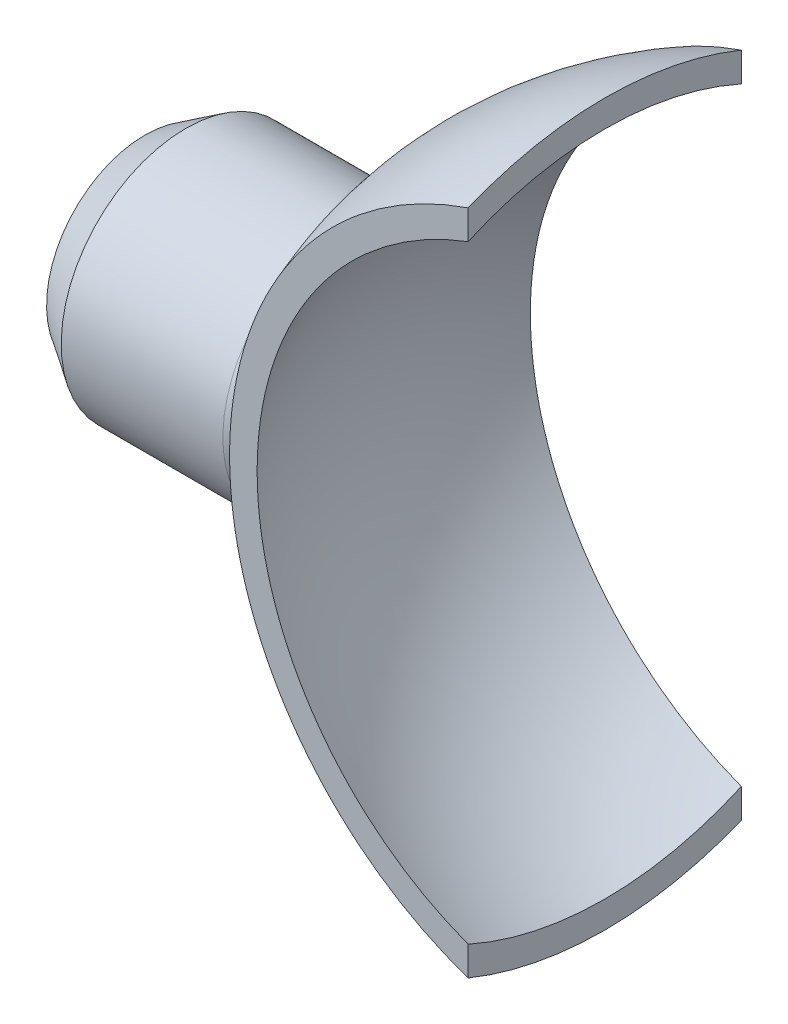
ISO-10303-21;
HEADER;
FILE_DESCRIPTION(('STEP AP214'),'2;1');
FILE_NAME('part.step','',(''),(''),'','','');
FILE_SCHEMA(('AUTOMOTIVE_DESIGN { 1 0 10303 214 1 1 1 1 }'));
ENDSEC;
DATA;
#1=APPLICATION_CONTEXT('core data for automotive mechanical design processes');
#2=APPLICATION_PROTOCOL_DEFINITION('international standard','automotive_design',2000,#1);
#3=PRODUCT_CONTEXT('',#1,'mechanical');
#4=PRODUCT('Part','Part','',(#3));
#5=PRODUCT_RELATED_PRODUCT_CATEGORY('part','',(#4));
#6=PRODUCT_DEFINITION_FORMATION('','',#4);
#7=PRODUCT_DEFINITION_CONTEXT('part definition',#1,'design');
#8=PRODUCT_DEFINITION('design','',#6,#7);
#9=PRODUCT_DEFINITION_SHAPE('','',#8);
#10=(LENGTH_UNIT() NAMED_UNIT(*) SI_UNIT(.MILLI.,.METRE.));
#11=(NAMED_UNIT(*) PLANE_ANGLE_UNIT() SI_UNIT($,.RADIAN.));
#12=(NAMED_UNIT(*) SI_UNIT($,.STERADIAN.) SOLID_ANGLE_UNIT());
#13=UNCERTAINTY_MEASURE_WITH_UNIT(LENGTH_MEASURE(1.E-05),#10,'distance_accuracy_value','');
#14=(GEOMETRIC_REPRESENTATION_CONTEXT(3) GLOBAL_UNCERTAINTY_ASSIGNED_CONTEXT((#13)) GLOBAL_UNIT_ASSIGNED_CONTEXT((#10,
#11,#12)) REPRESENTATION_CONTEXT('',''));
#15=CARTESIAN_POINT('',(0.,0.,0.));
#16=DIRECTION('',(0.,0.,1.));
#17=DIRECTION('',(1.,0.,0.));
#18=AXIS2_PLACEMENT_3D('',#15,#16,#17);
#19=CARTESIAN_POINT('',(7.09806099724113,9.9227201678389,0.));
#20=DIRECTION('',(1.,0.,0.));
#21=DIRECTION('',(0.,1.,0.));
#22=AXIS2_PLACEMENT_3D('',#19,#20,#21);
#23=PLANE('',#22);
#24=DIRECTION('',(0.,-1.,0.));
#25=VECTOR('',#24,1.);
#26=CARTESIAN_POINT('',(7.09806099724113,9.9227201678389,-4.065));
#27=LINE('',#26,#25);
#28=CARTESIAN_POINT('',(7.09806099724113,9.92284118305109,-4.065));
#29=VERTEX_POINT('',#28);
#30=CARTESIAN_POINT('',(7.09806099724113,9.05185895433843,-4.065));
#31=VERTEX_POINT('',#30);
#32=EDGE_CURVE('E72',#29,#31,#27,.T.);
#33=ORIENTED_EDGE('',*,*,#32,.F.);
#34=CARTESIAN_POINT('',(7.09806099724114,0.,0.));
#35=DIRECTION('',(1.,0.,0.));
#36=DIRECTION('',(0.,1.,0.));
#37=AXIS2_PLACEMENT_3D('',#34,#35,#36);
#38=CIRCLE('',#37,10.7231992494803);
#39=CARTESIAN_POINT('',(7.09806099724114,9.92284118305109,4.065));
#40=VERTEX_POINT('',#39);
#41=EDGE_CURVE('E54',#29,#40,#38,.T.);
#42=ORIENTED_EDGE('',*,*,#41,.T.);
#43=DIRECTION('',(0.,1.,0.));
#44=VECTOR('',#43,1.);
#45=CARTESIAN_POINT('',(7.09806099724113,9.9227201678389,4.065));
#46=LINE('',#45,#44);
#47=CARTESIAN_POINT('',(7.09806099724113,9.05185895433843,4.065));
#48=VERTEX_POINT('',#47);
#49=EDGE_CURVE('E100',#48,#40,#46,.T.);
#50=ORIENTED_EDGE('',*,*,#49,.F.);
#51=CARTESIAN_POINT('',(7.09806099724113,0.,0.));
#52=DIRECTION('',(1.,0.,0.));
#53=DIRECTION('',(0.,1.,0.));
#54=AXIS2_PLACEMENT_3D('',#51,#52,#53);
#55=CIRCLE('',#54,9.9227201678389);
#56=EDGE_CURVE('E78',#31,#48,#55,.T.);
#57=ORIENTED_EDGE('',*,*,#56,.F.);
#58=EDGE_LOOP('',(#33,#42,#50,#57));
#59=FACE_BOUND('',#58,.T.);
#60=ADVANCED_FACE('F32',(#59),#23,.T.);
#61=CARTESIAN_POINT('',(10.4847539002303,0.,0.));
#62=DIRECTION('',(1.,0.,0.));
#63=DIRECTION('',(0.,1.,0.));
#64=AXIS2_PLACEMENT_3D('',#61,#62,#63);
#65=SPHERICAL_SURFACE('',#64,10.4847539002303);
#66=CARTESIAN_POINT('',(10.4847539002303,0.,-4.065));
#67=DIRECTION('',(0.,0.,1.));
#68=DIRECTION('',(1.,0.,0.));
#69=AXIS2_PLACEMENT_3D('',#66,#67,#68);
#70=CIRCLE('',#69,9.66466964507291);
#71=CARTESIAN_POINT('',(7.09806099724114,-9.05185895433843,-4.065));
#72=VERTEX_POINT('',#71);
#73=EDGE_CURVE('E79',#31,#72,#70,.T.);
#74=ORIENTED_EDGE('',*,*,#73,.F.);
#75=ORIENTED_EDGE('',*,*,#56,.T.);
#76=CARTESIAN_POINT('',(10.4847539002303,0.,4.065));
#77=DIRECTION('',(0.,0.,-1.));
#78=DIRECTION('',(-1.,0.,0.));
#79=AXIS2_PLACEMENT_3D('',#76,#77,#78);
#80=CIRCLE('',#79,9.66466964507291);
#81=CARTESIAN_POINT('',(7.09806099724114,-9.05185895433843,4.065));
#82=VERTEX_POINT('',#81);
#83=EDGE_CURVE('E104',#82,#48,#80,.T.);
#84=ORIENTED_EDGE('',*,*,#83,.F.);
#85=EDGE_CURVE('E92',#82,#72,#55,.T.);
#86=ORIENTED_EDGE('',*,*,#85,.T.);
#87=EDGE_LOOP('',(#74,#75,#84,#86));
#88=FACE_BOUND('',#87,.T.);
#89=ADVANCED_FACE('F34',(#88),#65,.F.);
#90=CARTESIAN_POINT('',(7.09806099724114,-9.92284118305108,-4.065));
#91=VERTEX_POINT('',#90);
#92=EDGE_CURVE('E46',#72,#91,#27,.T.);
#93=ORIENTED_EDGE('',*,*,#92,.F.);
#94=ORIENTED_EDGE('',*,*,#85,.F.);
#95=CARTESIAN_POINT('',(7.09806099724114,-9.92284118305108,4.065));
#96=VERTEX_POINT('',#95);
#97=EDGE_CURVE('E98',#96,#82,#46,.T.);
#98=ORIENTED_EDGE('',*,*,#97,.F.);
#99=EDGE_CURVE('E84',#96,#91,#38,.T.);
#100=ORIENTED_EDGE('',*,*,#99,.T.);
#101=EDGE_LOOP('',(#93,#94,#98,#100));
#102=FACE_BOUND('',#101,.T.);
#103=ADVANCED_FACE('F103',(#102),#23,.T.);
#104=CARTESIAN_POINT('',(10.4847539002303,0.,0.));
#105=DIRECTION('',(1.,0.,0.));
#106=DIRECTION('',(0.,1.,0.));
#107=AXIS2_PLACEMENT_3D('',#104,#105,#106);
#108=SPHERICAL_SURFACE('',#107,11.2452963928574);
#109=CARTESIAN_POINT('',(10.4847539002303,0.,-4.065));
#110=DIRECTION('',(0.,0.,1.));
#111=DIRECTION('',(1.,0.,0.));
#112=AXIS2_PLACEMENT_3D('',#109,#110,#111);
#113=CIRCLE('',#112,10.4848684285122);
#114=EDGE_CURVE('E11',#91,#29,#113,.F.);
#115=ORIENTED_EDGE('',*,*,#114,.F.);
#116=ORIENTED_EDGE('',*,*,#99,.F.);
#117=CARTESIAN_POINT('',(10.4847539002303,0.,4.065));
#118=DIRECTION('',(0.,0.,-1.));
#119=DIRECTION('',(-1.,0.,0.));
#120=AXIS2_PLACEMENT_3D('',#117,#118,#119);
#121=CIRCLE('',#120,10.4848684285122);
#122=EDGE_CURVE('E40',#40,#96,#121,.F.);
#123=ORIENTED_EDGE('',*,*,#122,.F.);
#124=ORIENTED_EDGE('',*,*,#41,.F.);
#125=EDGE_LOOP('',(#115,#116,#123,#124));
#126=FACE_BOUND('',#125,.T.);
#127=CARTESIAN_POINT('',(-0.181803757191167,0.,0.));
#128=DIRECTION('',(1.,0.,0.));
#129=DIRECTION('',(0.,1.,0.));
#130=AXIS2_PLACEMENT_3D('',#127,#128,#129);
#131=CIRCLE('',#130,3.56107269009153);
#132=CARTESIAN_POINT('',(-0.181803757191168,3.56107269009153,0.));
#133=VERTEX_POINT('',#132);
#134=EDGE_CURVE('E85',#133,#133,#131,.T.);
#135=ORIENTED_EDGE('',*,*,#134,.T.);
#136=EDGE_LOOP('',(#135));
#137=FACE_BOUND('',#136,.T.);
#138=ADVANCED_FACE('F82',(#126,#137),#108,.T.);
#139=CARTESIAN_POINT('',(-0.577905532648054,0.,0.));
#140=DIRECTION('',(1.,0.,0.));
#141=DIRECTION('',(0.,1.,0.));
#142=AXIS2_PLACEMENT_3D('',#139,#140,#141);
#143=TOROIDAL_SURFACE('',#142,3.09802134378221,0.609354712658379);
#144=CARTESIAN_POINT('',(-0.558844205161113,0.,0.));
#145=DIRECTION('',(1.,0.,0.));
#146=DIRECTION('',(0.,1.,0.));
#147=AXIS2_PLACEMENT_3D('',#144,#145,#146);
#148=CIRCLE('',#147,3.70707785317474);
#149=CARTESIAN_POINT('',(-0.558844205161113,3.70707785317474,0.));
#150=VERTEX_POINT('',#149);
#151=EDGE_CURVE('E88',#150,#150,#148,.T.);
#152=ORIENTED_EDGE('',*,*,#151,.T.);
#153=EDGE_LOOP('',(#152));
#154=FACE_BOUND('',#153,.T.);
#155=ORIENTED_EDGE('',*,*,#134,.F.);
#156=EDGE_LOOP('',(#155));
#157=FACE_BOUND('',#156,.T.);
#158=ADVANCED_FACE('F129',(#154,#157),#143,.T.);
#159=CARTESIAN_POINT('',(0.,0.,0.));
#160=DIRECTION('',(1.,0.,0.));
#161=DIRECTION('',(0.,1.,0.));
#162=AXIS2_PLACEMENT_3D('',#159,#160,#161);
#163=CYLINDRICAL_SURFACE('',#162,3.70707785317474);
#164=CARTESIAN_POINT('',(-5.36748251392799,0.,0.));
#165=DIRECTION('',(1.,0.,0.));
#166=DIRECTION('',(0.,1.,0.));
#167=AXIS2_PLACEMENT_3D('',#164,#165,#166);
#168=CIRCLE('',#167,3.70707785317474);
#169=CARTESIAN_POINT('',(-5.36748251392799,3.70707785317474,0.));
#170=VERTEX_POINT('',#169);
#171=EDGE_CURVE('E124',#170,#170,#168,.T.);
#172=ORIENTED_EDGE('',*,*,#171,.T.);
#173=EDGE_LOOP('',(#172));
#174=FACE_BOUND('',#173,.T.);
#175=ORIENTED_EDGE('',*,*,#151,.F.);
#176=EDGE_LOOP('',(#175));
#177=FACE_BOUND('',#176,.T.);
#178=ADVANCED_FACE('F132',(#174,#177),#163,.T.);
#179=CARTESIAN_POINT('',(-5.36748251392799,0.,0.));
#180=DIRECTION('',(1.,0.,0.));
#181=DIRECTION('',(0.,1.,0.));
#182=AXIS2_PLACEMENT_3D('',#179,#180,#181);
#183=CONICAL_SURFACE('',#182,3.70707785317474,0.570000176005232);
#184=CARTESIAN_POINT('',(-6.58167295576422,0.,0.));
#185=DIRECTION('',(1.,0.,0.));
#186=DIRECTION('',(0.,1.,0.));
#187=AXIS2_PLACEMENT_3D('',#184,#185,#186);
#188=CIRCLE('',#187,2.92881966266729);
#189=CARTESIAN_POINT('',(-6.58167295576422,2.92881966266729,0.));
#190=VERTEX_POINT('',#189);
#191=EDGE_CURVE('E121',#190,#190,#188,.T.);
#192=ORIENTED_EDGE('',*,*,#191,.T.);
#193=EDGE_LOOP('',(#192));
#194=FACE_BOUND('',#193,.T.);
#195=ORIENTED_EDGE('',*,*,#171,.F.);
#196=EDGE_LOOP('',(#195));
#197=FACE_BOUND('',#196,.T.);
#198=ADVANCED_FACE('F134',(#194,#197),#183,.T.);
#199=CARTESIAN_POINT('',(-6.58167295576422,2.92881966266729,0.));
#200=DIRECTION('',(-1.,0.,0.));
#201=DIRECTION('',(0.,-1.,0.));
#202=AXIS2_PLACEMENT_3D('',#199,#200,#201);
#203=PLANE('',#202);
#204=CARTESIAN_POINT('',(-6.58167295576422,0.,0.));
#205=DIRECTION('',(1.,0.,0.));
#206=DIRECTION('',(0.,1.,0.));
#207=AXIS2_PLACEMENT_3D('',#204,#205,#206);
#208=CIRCLE('',#207,2.14522291845564);
#209=CARTESIAN_POINT('',(-6.58167295576422,2.14522291845564,0.));
#210=VERTEX_POINT('',#209);
#211=EDGE_CURVE('E118',#210,#210,#208,.T.);
#212=ORIENTED_EDGE('',*,*,#211,.T.);
#213=EDGE_LOOP('',(#212));
#214=FACE_BOUND('',#213,.T.);
#215=ORIENTED_EDGE('',*,*,#191,.F.);
#216=EDGE_LOOP('',(#215));
#217=FACE_BOUND('',#216,.T.);
#218=ADVANCED_FACE('F141',(#214,#217),#203,.T.);
#219=CARTESIAN_POINT('',(-6.58167295576422,0.,0.));
#220=DIRECTION('',(-1.,0.,0.));
#221=DIRECTION('',(0.,-1.,0.));
#222=AXIS2_PLACEMENT_3D('',#219,#220,#221);
#223=CONICAL_SURFACE('',#222,2.14522291845564,0.00106746955532886);
#224=CARTESIAN_POINT('',(-1.32512154956995,0.,0.));
#225=DIRECTION('',(1.,0.,0.));
#226=DIRECTION('',(0.,1.,0.));
#227=AXIS2_PLACEMENT_3D('',#224,#225,#226);
#228=CIRCLE('',#227,2.1396117077322);
#229=CARTESIAN_POINT('',(-1.32512154956995,2.1396117077322,0.));
#230=VERTEX_POINT('',#229);
#231=EDGE_CURVE('E115',#230,#230,#228,.T.);
#232=ORIENTED_EDGE('',*,*,#231,.T.);
#233=EDGE_LOOP('',(#232));
#234=FACE_BOUND('',#233,.T.);
#235=ORIENTED_EDGE('',*,*,#211,.F.);
#236=EDGE_LOOP('',(#235));
#237=FACE_BOUND('',#236,.T.);
#238=ADVANCED_FACE('F181',(#234,#237),#223,.F.);
#239=CARTESIAN_POINT('',(-1.32512154956984,2.1396117077322,0.));
#240=DIRECTION('',(-1.,0.,0.));
#241=DIRECTION('',(0.,-1.,0.));
#242=AXIS2_PLACEMENT_3D('',#239,#240,#241);
#243=PLANE('',#242);
#244=CARTESIAN_POINT('',(-1.32512154956974,0.,0.));
#245=DIRECTION('',(1.,0.,0.));
#246=DIRECTION('',(0.,1.,0.));
#247=AXIS2_PLACEMENT_3D('',#244,#245,#246);
#248=CIRCLE('',#247,0.570301782460266);
#249=CARTESIAN_POINT('',(-1.32512154956974,0.570301782460265,0.));
#250=VERTEX_POINT('',#249);
#251=EDGE_CURVE('E112',#250,#250,#248,.T.);
#252=ORIENTED_EDGE('',*,*,#251,.T.);
#253=EDGE_LOOP('',(#252));
#254=FACE_BOUND('',#253,.T.);
#255=ORIENTED_EDGE('',*,*,#231,.F.);
#256=EDGE_LOOP('',(#255));
#257=FACE_BOUND('',#256,.T.);
#258=ADVANCED_FACE('F191',(#254,#257),#243,.T.);
#259=CARTESIAN_POINT('',(0.,0.,0.));
#260=DIRECTION('',(1.,0.,0.));
#261=DIRECTION('',(0.,1.,0.));
#262=AXIS2_PLACEMENT_3D('',#259,#260,#261);
#263=CYLINDRICAL_SURFACE('',#262,0.570301782460265);
#264=CARTESIAN_POINT('',(-0.411194992754944,0.,0.));
#265=DIRECTION('',(1.,0.,0.));
#266=DIRECTION('',(0.,1.,0.));
#267=AXIS2_PLACEMENT_3D('',#264,#265,#266);
#268=CIRCLE('',#267,0.570301782460264);
#269=CARTESIAN_POINT('',(-0.411194992754944,0.570301782460264,0.));
#270=VERTEX_POINT('',#269);
#271=EDGE_CURVE('E106',#270,#270,#268,.T.);
#272=ORIENTED_EDGE('',*,*,#271,.T.);
#273=EDGE_LOOP('',(#272));
#274=FACE_BOUND('',#273,.T.);
#275=ORIENTED_EDGE('',*,*,#251,.F.);
#276=EDGE_LOOP('',(#275));
#277=FACE_BOUND('',#276,.T.);
#278=ADVANCED_FACE('F201',(#274,#277),#263,.F.);
#279=CARTESIAN_POINT('',(10.484753900229,0.,0.));
#280=DIRECTION('',(1.,0.,0.));
#281=DIRECTION('',(0.,1.,0.));
#282=AXIS2_PLACEMENT_3D('',#279,#280,#281);
#283=SPHERICAL_SURFACE('',#282,10.9108636872429);
#284=ORIENTED_EDGE('',*,*,#271,.F.);
#285=EDGE_LOOP('',(#284));
#286=FACE_BOUND('',#285,.T.);
#287=ADVANCED_FACE('F211',(#286),#283,.T.);
#288=CARTESIAN_POINT('',(11.4183270442358,0.,4.065));
#289=DIRECTION('',(0.,0.,-1.));
#290=DIRECTION('',(-1.,0.,0.));
#291=AXIS2_PLACEMENT_3D('',#288,#289,#290);
#292=PLANE('',#291);
#293=ORIENTED_EDGE('',*,*,#83,.T.);
#294=ORIENTED_EDGE('',*,*,#49,.T.);
#295=ORIENTED_EDGE('',*,*,#122,.T.);
#296=ORIENTED_EDGE('',*,*,#97,.T.);
#297=EDGE_LOOP('',(#293,#294,#295,#296));
#298=FACE_BOUND('',#297,.T.);
#299=ADVANCED_FACE('F97',(#298),#292,.F.);
#300=CARTESIAN_POINT('',(11.4183270442358,0.,-4.065));
#301=DIRECTION('',(0.,0.,1.));
#302=DIRECTION('',(1.,0.,0.));
#303=AXIS2_PLACEMENT_3D('',#300,#301,#302);
#304=PLANE('',#303);
#305=ORIENTED_EDGE('',*,*,#73,.T.);
#306=ORIENTED_EDGE('',*,*,#92,.T.);
#307=ORIENTED_EDGE('',*,*,#114,.T.);
#308=ORIENTED_EDGE('',*,*,#32,.T.);
#309=EDGE_LOOP('',(#305,#306,#307,#308));
#310=FACE_BOUND('',#309,.T.);
#311=ADVANCED_FACE('F71',(#310),#304,.F.);
#312=CLOSED_SHELL('',(#60,#89,#103,#138,#158,#178,#198,#218,#238,#258,#278,#287,#299,#311));
#313=MANIFOLD_SOLID_BREP('B2',#312);
#314=ADVANCED_BREP_SHAPE_REPRESENTATION('',(#18,#313),#14);
#315=SHAPE_DEFINITION_REPRESENTATION(#9,#314);
ENDSEC;
END-ISO-10303-21;
